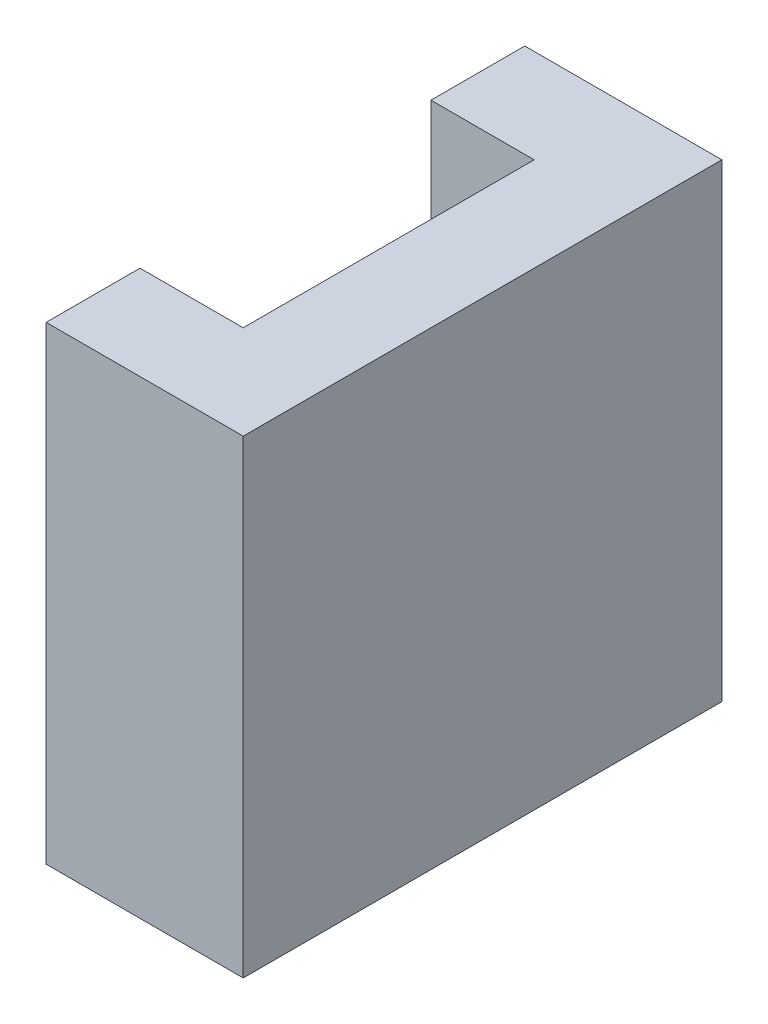
ISO-10303-21;
HEADER;
FILE_DESCRIPTION(('STEP AP214'),'2;1');
FILE_NAME('part.step','',(''),(''),'','','');
FILE_SCHEMA(('AUTOMOTIVE_DESIGN { 1 0 10303 214 1 1 1 1 }'));
ENDSEC;
DATA;
#1=APPLICATION_CONTEXT('core data for automotive mechanical design processes');
#2=APPLICATION_PROTOCOL_DEFINITION('international standard','automotive_design',2000,#1);
#3=PRODUCT_CONTEXT('',#1,'mechanical');
#4=PRODUCT('Part','Part','',(#3));
#5=PRODUCT_RELATED_PRODUCT_CATEGORY('part','',(#4));
#6=PRODUCT_DEFINITION_FORMATION('','',#4);
#7=PRODUCT_DEFINITION_CONTEXT('part definition',#1,'design');
#8=PRODUCT_DEFINITION('design','',#6,#7);
#9=PRODUCT_DEFINITION_SHAPE('','',#8);
#10=(LENGTH_UNIT() NAMED_UNIT(*) SI_UNIT(.MILLI.,.METRE.));
#11=(NAMED_UNIT(*) PLANE_ANGLE_UNIT() SI_UNIT($,.RADIAN.));
#12=(NAMED_UNIT(*) SI_UNIT($,.STERADIAN.) SOLID_ANGLE_UNIT());
#13=UNCERTAINTY_MEASURE_WITH_UNIT(LENGTH_MEASURE(1.E-05),#10,'distance_accuracy_value','');
#14=(GEOMETRIC_REPRESENTATION_CONTEXT(3) GLOBAL_UNCERTAINTY_ASSIGNED_CONTEXT((#13)) GLOBAL_UNIT_ASSIGNED_CONTEXT((#10,
#11,#12)) REPRESENTATION_CONTEXT('',''));
#15=CARTESIAN_POINT('',(0.,0.,0.));
#16=DIRECTION('',(0.,0.,1.));
#17=DIRECTION('',(1.,0.,0.));
#18=AXIS2_PLACEMENT_3D('',#15,#16,#17);
#19=CARTESIAN_POINT('',(5.5,0.,-5.65463917525774));
#20=DIRECTION('',(0.,0.,-1.));
#21=DIRECTION('',(0.,1.,0.));
#22=AXIS2_PLACEMENT_3D('',#19,#20,#21);
#23=PLANE('',#22);
#24=DIRECTION('',(0.,-1.,0.));
#25=VECTOR('',#24,1.);
#26=CARTESIAN_POINT('',(0.,0.,-5.65463917525774));
#27=LINE('',#26,#25);
#28=CARTESIAN_POINT('',(0.,13.1413205577831,-5.65463917525773));
#29=VERTEX_POINT('',#28);
#30=CARTESIAN_POINT('',(0.,-11.8586794422169,-5.65463917525774));
#31=VERTEX_POINT('',#30);
#32=EDGE_CURVE('E116',#29,#31,#27,.T.);
#33=ORIENTED_EDGE('',*,*,#32,.F.);
#34=DIRECTION('',(-1.,0.,0.));
#35=VECTOR('',#34,1.);
#36=CARTESIAN_POINT('',(5.5,13.1413205577831,-5.65463917525773));
#37=LINE('',#36,#35);
#38=CARTESIAN_POINT('',(10.5,13.1413205577831,-5.65463917525774));
#39=VERTEX_POINT('',#38);
#40=EDGE_CURVE('E11',#39,#29,#37,.T.);
#41=ORIENTED_EDGE('',*,*,#40,.F.);
#42=DIRECTION('',(0.,1.,0.));
#43=VECTOR('',#42,1.);
#44=CARTESIAN_POINT('',(10.5,13.1413205577831,-5.65463917525774));
#45=LINE('',#44,#43);
#46=CARTESIAN_POINT('',(10.5,-11.8586794422169,-5.65463917525774));
#47=VERTEX_POINT('',#46);
#48=EDGE_CURVE('E193',#47,#39,#45,.T.);
#49=ORIENTED_EDGE('',*,*,#48,.F.);
#50=DIRECTION('',(-1.,0.,0.));
#51=VECTOR('',#50,1.);
#52=CARTESIAN_POINT('',(5.5,-11.8586794422169,-5.65463917525774));
#53=LINE('',#52,#51);
#54=EDGE_CURVE('E111',#47,#31,#53,.T.);
#55=ORIENTED_EDGE('',*,*,#54,.T.);
#56=EDGE_LOOP('',(#33,#41,#49,#55));
#57=FACE_BOUND('',#56,.T.);
#58=ADVANCED_FACE('F41',(#57),#23,.T.);
#59=CARTESIAN_POINT('',(5.5,0.,-0.654639175257735));
#60=DIRECTION('',(0.,0.,-1.));
#61=DIRECTION('',(0.,1.,0.));
#62=AXIS2_PLACEMENT_3D('',#59,#60,#61);
#63=PLANE('',#62);
#64=DIRECTION('',(0.,-1.,0.));
#65=VECTOR('',#64,1.);
#66=CARTESIAN_POINT('',(0.,0.,-0.654639175257735));
#67=LINE('',#66,#65);
#68=CARTESIAN_POINT('',(0.,13.1413205577831,-0.654639175257734));
#69=VERTEX_POINT('',#68);
#70=CARTESIAN_POINT('',(0.,-6.85867944221686,-0.654639175257736));
#71=VERTEX_POINT('',#70);
#72=EDGE_CURVE('E145',#69,#71,#67,.T.);
#73=ORIENTED_EDGE('',*,*,#72,.T.);
#74=DIRECTION('',(-1.,0.,0.));
#75=VECTOR('',#74,1.);
#76=CARTESIAN_POINT('',(5.5,-6.85867944221686,-0.654639175257736));
#77=LINE('',#76,#75);
#78=CARTESIAN_POINT('',(5.5,-6.85867944221686,-0.654639175257736));
#79=VERTEX_POINT('',#78);
#80=EDGE_CURVE('E135',#79,#71,#77,.T.);
#81=ORIENTED_EDGE('',*,*,#80,.F.);
#82=DIRECTION('',(0.,-1.,0.));
#83=VECTOR('',#82,1.);
#84=CARTESIAN_POINT('',(5.5,0.,-0.654639175257735));
#85=LINE('',#84,#83);
#86=CARTESIAN_POINT('',(5.5,13.1413205577831,-0.654639175257727));
#87=VERTEX_POINT('',#86);
#88=EDGE_CURVE('E118',#87,#79,#85,.T.);
#89=ORIENTED_EDGE('',*,*,#88,.F.);
#90=DIRECTION('',(-1.,0.,0.));
#91=VECTOR('',#90,1.);
#92=CARTESIAN_POINT('',(5.5,13.1413205577831,-0.654639175257734));
#93=LINE('',#92,#91);
#94=EDGE_CURVE('E50',#87,#69,#93,.T.);
#95=ORIENTED_EDGE('',*,*,#94,.T.);
#96=EDGE_LOOP('',(#73,#81,#89,#95));
#97=FACE_BOUND('',#96,.T.);
#98=ADVANCED_FACE('F143',(#97),#63,.F.);
#99=CARTESIAN_POINT('',(5.5,-6.85867944221686,0.));
#100=DIRECTION('',(0.,1.,0.));
#101=DIRECTION('',(0.,0.,1.));
#102=AXIS2_PLACEMENT_3D('',#99,#100,#101);
#103=PLANE('',#102);
#104=DIRECTION('',(0.,0.,-1.));
#105=VECTOR('',#104,1.);
#106=CARTESIAN_POINT('',(0.,-6.85867944221686,0.));
#107=LINE('',#106,#105);
#108=CARTESIAN_POINT('',(0.,-6.85867944221686,14.8453608247423));
#109=VERTEX_POINT('',#108);
#110=EDGE_CURVE('E154',#109,#71,#107,.T.);
#111=ORIENTED_EDGE('',*,*,#110,.F.);
#112=DIRECTION('',(-1.,0.,0.));
#113=VECTOR('',#112,1.);
#114=CARTESIAN_POINT('',(5.5,-6.85867944221686,14.8453608247423));
#115=LINE('',#114,#113);
#116=CARTESIAN_POINT('',(5.5,-6.85867944221686,14.8453608247423));
#117=VERTEX_POINT('',#116);
#118=EDGE_CURVE('E132',#117,#109,#115,.T.);
#119=ORIENTED_EDGE('',*,*,#118,.F.);
#120=DIRECTION('',(0.,0.,-1.));
#121=VECTOR('',#120,1.);
#122=CARTESIAN_POINT('',(5.5,-6.85867944221686,0.));
#123=LINE('',#122,#121);
#124=EDGE_CURVE('E57',#117,#79,#123,.T.);
#125=ORIENTED_EDGE('',*,*,#124,.T.);
#126=ORIENTED_EDGE('',*,*,#80,.T.);
#127=EDGE_LOOP('',(#111,#119,#125,#126));
#128=FACE_BOUND('',#127,.T.);
#129=ADVANCED_FACE('F177',(#128),#103,.T.);
#130=CARTESIAN_POINT('',(5.5,0.,14.8453608247423));
#131=DIRECTION('',(0.,0.,-1.));
#132=DIRECTION('',(0.,1.,0.));
#133=AXIS2_PLACEMENT_3D('',#130,#131,#132);
#134=PLANE('',#133);
#135=DIRECTION('',(0.,-1.,0.));
#136=VECTOR('',#135,1.);
#137=CARTESIAN_POINT('',(0.,0.,14.8453608247423));
#138=LINE('',#137,#136);
#139=CARTESIAN_POINT('',(0.,13.1413205577831,14.8453608247423));
#140=VERTEX_POINT('',#139);
#141=EDGE_CURVE('E166',#140,#109,#138,.T.);
#142=ORIENTED_EDGE('',*,*,#141,.F.);
#143=DIRECTION('',(-1.,0.,0.));
#144=VECTOR('',#143,1.);
#145=CARTESIAN_POINT('',(5.5,13.1413205577831,14.8453608247423));
#146=LINE('',#145,#144);
#147=CARTESIAN_POINT('',(5.5,13.1413205577831,14.8453608247423));
#148=VERTEX_POINT('',#147);
#149=EDGE_CURVE('E129',#148,#140,#146,.T.);
#150=ORIENTED_EDGE('',*,*,#149,.F.);
#151=DIRECTION('',(0.,-1.,0.));
#152=VECTOR('',#151,1.);
#153=CARTESIAN_POINT('',(5.5,0.,14.8453608247423));
#154=LINE('',#153,#152);
#155=EDGE_CURVE('E125',#148,#117,#154,.T.);
#156=ORIENTED_EDGE('',*,*,#155,.T.);
#157=ORIENTED_EDGE('',*,*,#118,.T.);
#158=EDGE_LOOP('',(#142,#150,#156,#157));
#159=FACE_BOUND('',#158,.T.);
#160=ADVANCED_FACE('F173',(#159),#134,.T.);
#161=CARTESIAN_POINT('',(5.5,13.1413205577831,0.));
#162=DIRECTION('',(0.,1.,0.));
#163=DIRECTION('',(0.,0.,1.));
#164=AXIS2_PLACEMENT_3D('',#161,#162,#163);
#165=PLANE('',#164);
#166=DIRECTION('',(0.,0.,-1.));
#167=VECTOR('',#166,1.);
#168=CARTESIAN_POINT('',(0.,13.1413205577831,0.));
#169=LINE('',#168,#167);
#170=CARTESIAN_POINT('',(0.,13.1413205577831,19.8453608247423));
#171=VERTEX_POINT('',#170);
#172=EDGE_CURVE('E100',#171,#140,#169,.T.);
#173=ORIENTED_EDGE('',*,*,#172,.F.);
#174=DIRECTION('',(-1.,0.,0.));
#175=VECTOR('',#174,1.);
#176=CARTESIAN_POINT('',(5.5,13.1413205577831,19.8453608247423));
#177=LINE('',#176,#175);
#178=CARTESIAN_POINT('',(10.5,13.1413205577831,19.8453608247423));
#179=VERTEX_POINT('',#178);
#180=EDGE_CURVE('E93',#179,#171,#177,.T.);
#181=ORIENTED_EDGE('',*,*,#180,.F.);
#182=DIRECTION('',(0.,0.,1.));
#183=VECTOR('',#182,1.);
#184=CARTESIAN_POINT('',(10.5,13.1413205577831,19.8453608247423));
#185=LINE('',#184,#183);
#186=EDGE_CURVE('E163',#39,#179,#185,.T.);
#187=ORIENTED_EDGE('',*,*,#186,.F.);
#188=ORIENTED_EDGE('',*,*,#40,.T.);
#189=EDGE_CURVE('E151',#69,#29,#169,.T.);
#190=ORIENTED_EDGE('',*,*,#189,.F.);
#191=ORIENTED_EDGE('',*,*,#94,.F.);
#192=DIRECTION('',(0.,0.,1.));
#193=VECTOR('',#192,1.);
#194=CARTESIAN_POINT('',(5.5,13.1413205577831,19.8453608247423));
#195=LINE('',#194,#193);
#196=EDGE_CURVE('E203',#87,#148,#195,.T.);
#197=ORIENTED_EDGE('',*,*,#196,.T.);
#198=ORIENTED_EDGE('',*,*,#149,.T.);
#199=EDGE_LOOP('',(#173,#181,#187,#188,#190,#191,#197,#198));
#200=FACE_BOUND('',#199,.T.);
#201=ADVANCED_FACE('F157',(#200),#165,.T.);
#202=CARTESIAN_POINT('',(5.5,0.,19.8453608247423));
#203=DIRECTION('',(0.,0.,-1.));
#204=DIRECTION('',(-1.,0.,0.));
#205=AXIS2_PLACEMENT_3D('',#202,#203,#204);
#206=PLANE('',#205);
#207=DIRECTION('',(0.,-1.,0.));
#208=VECTOR('',#207,1.);
#209=CARTESIAN_POINT('',(0.,0.,19.8453608247423));
#210=LINE('',#209,#208);
#211=CARTESIAN_POINT('',(0.,-11.8586794422169,19.8453608247423));
#212=VERTEX_POINT('',#211);
#213=EDGE_CURVE('E85',#171,#212,#210,.T.);
#214=ORIENTED_EDGE('',*,*,#213,.T.);
#215=DIRECTION('',(-1.,0.,0.));
#216=VECTOR('',#215,1.);
#217=CARTESIAN_POINT('',(5.5,-11.8586794422169,19.8453608247423));
#218=LINE('',#217,#216);
#219=CARTESIAN_POINT('',(10.5,-11.8586794422169,19.8453608247423));
#220=VERTEX_POINT('',#219);
#221=EDGE_CURVE('E90',#220,#212,#218,.T.);
#222=ORIENTED_EDGE('',*,*,#221,.F.);
#223=DIRECTION('',(0.,-1.,0.));
#224=VECTOR('',#223,1.);
#225=CARTESIAN_POINT('',(10.5,13.1413205577831,19.8453608247423));
#226=LINE('',#225,#224);
#227=EDGE_CURVE('E194',#179,#220,#226,.T.);
#228=ORIENTED_EDGE('',*,*,#227,.F.);
#229=ORIENTED_EDGE('',*,*,#180,.T.);
#230=EDGE_LOOP('',(#214,#222,#228,#229));
#231=FACE_BOUND('',#230,.T.);
#232=ADVANCED_FACE('F87',(#231),#206,.F.);
#233=CARTESIAN_POINT('',(5.5,-11.8586794422169,0.));
#234=DIRECTION('',(0.,1.,0.));
#235=DIRECTION('',(0.,0.,1.));
#236=AXIS2_PLACEMENT_3D('',#233,#234,#235);
#237=PLANE('',#236);
#238=DIRECTION('',(0.,0.,-1.));
#239=VECTOR('',#238,1.);
#240=CARTESIAN_POINT('',(0.,-11.8586794422169,0.));
#241=LINE('',#240,#239);
#242=EDGE_CURVE('E99',#212,#31,#241,.T.);
#243=ORIENTED_EDGE('',*,*,#242,.T.);
#244=ORIENTED_EDGE('',*,*,#54,.F.);
#245=DIRECTION('',(0.,0.,-1.));
#246=VECTOR('',#245,1.);
#247=CARTESIAN_POINT('',(10.5,-11.8586794422169,19.8453608247423));
#248=LINE('',#247,#246);
#249=EDGE_CURVE('E108',#220,#47,#248,.T.);
#250=ORIENTED_EDGE('',*,*,#249,.F.);
#251=ORIENTED_EDGE('',*,*,#221,.T.);
#252=EDGE_LOOP('',(#243,#244,#250,#251));
#253=FACE_BOUND('',#252,.T.);
#254=ADVANCED_FACE('F104',(#253),#237,.F.);
#255=CARTESIAN_POINT('',(0.,0.,0.));
#256=DIRECTION('',(1.,0.,0.));
#257=DIRECTION('',(0.,0.,-1.));
#258=AXIS2_PLACEMENT_3D('',#255,#256,#257);
#259=PLANE('',#258);
#260=ORIENTED_EDGE('',*,*,#32,.T.);
#261=ORIENTED_EDGE('',*,*,#242,.F.);
#262=ORIENTED_EDGE('',*,*,#213,.F.);
#263=ORIENTED_EDGE('',*,*,#172,.T.);
#264=ORIENTED_EDGE('',*,*,#141,.T.);
#265=ORIENTED_EDGE('',*,*,#110,.T.);
#266=ORIENTED_EDGE('',*,*,#72,.F.);
#267=ORIENTED_EDGE('',*,*,#189,.T.);
#268=EDGE_LOOP('',(#260,#261,#262,#263,#264,#265,#266,#267));
#269=FACE_BOUND('',#268,.T.);
#270=ADVANCED_FACE('F113',(#269),#259,.F.);
#271=CARTESIAN_POINT('',(5.5,0.,0.));
#272=DIRECTION('',(1.,0.,0.));
#273=DIRECTION('',(0.,0.,-1.));
#274=AXIS2_PLACEMENT_3D('',#271,#272,#273);
#275=PLANE('',#274);
#276=ORIENTED_EDGE('',*,*,#196,.F.);
#277=ORIENTED_EDGE('',*,*,#88,.T.);
#278=ORIENTED_EDGE('',*,*,#124,.F.);
#279=ORIENTED_EDGE('',*,*,#155,.F.);
#280=EDGE_LOOP('',(#276,#277,#278,#279));
#281=FACE_BOUND('',#280,.T.);
#282=ADVANCED_FACE('F210',(#281),#275,.F.);
#283=CARTESIAN_POINT('',(10.5,0.,0.));
#284=DIRECTION('',(1.,0.,0.));
#285=DIRECTION('',(0.,0.,-1.));
#286=AXIS2_PLACEMENT_3D('',#283,#284,#285);
#287=PLANE('',#286);
#288=ORIENTED_EDGE('',*,*,#227,.T.);
#289=ORIENTED_EDGE('',*,*,#249,.T.);
#290=ORIENTED_EDGE('',*,*,#48,.T.);
#291=ORIENTED_EDGE('',*,*,#186,.T.);
#292=EDGE_LOOP('',(#288,#289,#290,#291));
#293=FACE_BOUND('',#292,.T.);
#294=ADVANCED_FACE('F191',(#293),#287,.T.);
#295=CLOSED_SHELL('',(#58,#98,#129,#160,#201,#232,#254,#270,#282,#294));
#296=MANIFOLD_SOLID_BREP('B2',#295);
#297=ADVANCED_BREP_SHAPE_REPRESENTATION('',(#18,#296),#14);
#298=SHAPE_DEFINITION_REPRESENTATION(#9,#297);
ENDSEC;
END-ISO-10303-21;
